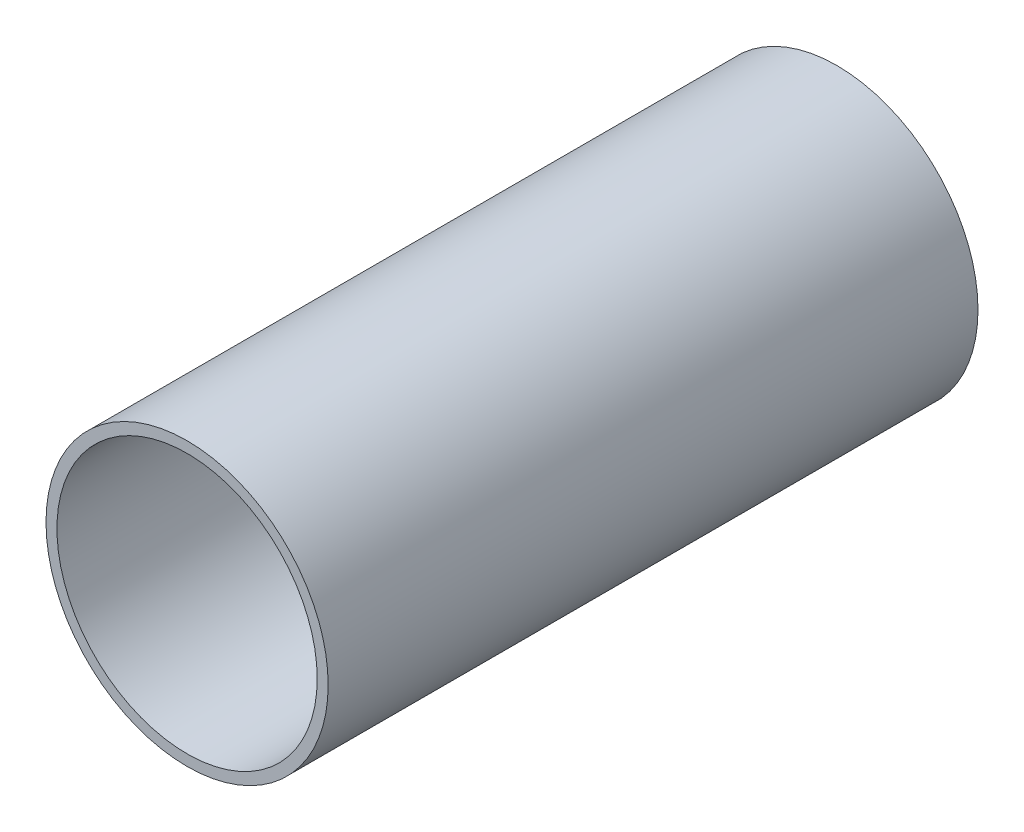
ISO-10303-21;
HEADER;
FILE_DESCRIPTION(('STEP AP214'),'2;1');
FILE_NAME('part.step','',(''),(''),'','','');
FILE_SCHEMA(('AUTOMOTIVE_DESIGN { 1 0 10303 214 1 1 1 1 }'));
ENDSEC;
DATA;
#1=APPLICATION_CONTEXT('core data for automotive mechanical design processes');
#2=APPLICATION_PROTOCOL_DEFINITION('international standard','automotive_design',2000,#1);
#3=PRODUCT_CONTEXT('',#1,'mechanical');
#4=PRODUCT('Part','Part','',(#3));
#5=PRODUCT_RELATED_PRODUCT_CATEGORY('part','',(#4));
#6=PRODUCT_DEFINITION_FORMATION('','',#4);
#7=PRODUCT_DEFINITION_CONTEXT('part definition',#1,'design');
#8=PRODUCT_DEFINITION('design','',#6,#7);
#9=PRODUCT_DEFINITION_SHAPE('','',#8);
#10=(LENGTH_UNIT() NAMED_UNIT(*) SI_UNIT(.MILLI.,.METRE.));
#11=(NAMED_UNIT(*) PLANE_ANGLE_UNIT() SI_UNIT($,.RADIAN.));
#12=(NAMED_UNIT(*) SI_UNIT($,.STERADIAN.) SOLID_ANGLE_UNIT());
#13=UNCERTAINTY_MEASURE_WITH_UNIT(LENGTH_MEASURE(1.E-05),#10,'distance_accuracy_value','');
#14=(GEOMETRIC_REPRESENTATION_CONTEXT(3) GLOBAL_UNCERTAINTY_ASSIGNED_CONTEXT((#13)) GLOBAL_UNIT_ASSIGNED_CONTEXT((#10,
#11,#12)) REPRESENTATION_CONTEXT('',''));
#15=CARTESIAN_POINT('',(0.,0.,0.));
#16=DIRECTION('',(0.,0.,1.));
#17=DIRECTION('',(1.,0.,0.));
#18=AXIS2_PLACEMENT_3D('',#15,#16,#17);
#19=CARTESIAN_POINT('',(240.,0.,308.5));
#20=DIRECTION('',(0.,0.,1.));
#21=DIRECTION('',(1.,0.,0.));
#22=AXIS2_PLACEMENT_3D('',#19,#20,#21);
#23=PLANE('',#22);
#24=CARTESIAN_POINT('',(240.,0.,308.5));
#25=DIRECTION('',(0.,0.,1.));
#26=DIRECTION('',(1.,0.,0.));
#27=AXIS2_PLACEMENT_3D('',#24,#25,#26);
#28=CIRCLE('',#27,80.);
#29=CARTESIAN_POINT('',(320.,0.,308.5));
#30=VERTEX_POINT('',#29);
#31=EDGE_CURVE('E10',#30,#30,#28,.T.);
#32=ORIENTED_EDGE('',*,*,#31,.T.);
#33=EDGE_LOOP('',(#32));
#34=FACE_BOUND('',#33,.T.);
#35=CARTESIAN_POINT('',(240.,0.,308.5));
#36=DIRECTION('',(0.,0.,1.));
#37=DIRECTION('',(1.,0.,0.));
#38=AXIS2_PLACEMENT_3D('',#35,#36,#37);
#39=CIRCLE('',#38,73.8);
#40=CARTESIAN_POINT('',(313.8,0.,308.5));
#41=VERTEX_POINT('',#40);
#42=EDGE_CURVE('E48',#41,#41,#39,.T.);
#43=ORIENTED_EDGE('',*,*,#42,.F.);
#44=EDGE_LOOP('',(#43));
#45=FACE_BOUND('',#44,.T.);
#46=ADVANCED_FACE('F40',(#34,#45),#23,.T.);
#47=CARTESIAN_POINT('',(240.,0.,-60.));
#48=DIRECTION('',(0.,0.,1.));
#49=DIRECTION('',(1.,0.,0.));
#50=AXIS2_PLACEMENT_3D('',#47,#48,#49);
#51=PLANE('',#50);
#52=CARTESIAN_POINT('',(240.,0.,-60.));
#53=DIRECTION('',(0.,0.,1.));
#54=DIRECTION('',(1.,0.,0.));
#55=AXIS2_PLACEMENT_3D('',#52,#53,#54);
#56=CIRCLE('',#55,80.);
#57=CARTESIAN_POINT('',(320.,0.,-60.));
#58=VERTEX_POINT('',#57);
#59=EDGE_CURVE('E41',#58,#58,#56,.T.);
#60=ORIENTED_EDGE('',*,*,#59,.F.);
#61=EDGE_LOOP('',(#60));
#62=FACE_BOUND('',#61,.T.);
#63=CARTESIAN_POINT('',(240.,0.,-60.));
#64=DIRECTION('',(0.,0.,1.));
#65=DIRECTION('',(1.,0.,0.));
#66=AXIS2_PLACEMENT_3D('',#63,#64,#65);
#67=CIRCLE('',#66,73.8);
#68=CARTESIAN_POINT('',(313.8,0.,-60.));
#69=VERTEX_POINT('',#68);
#70=EDGE_CURVE('E49',#69,#69,#67,.T.);
#71=ORIENTED_EDGE('',*,*,#70,.T.);
#72=EDGE_LOOP('',(#71));
#73=FACE_BOUND('',#72,.T.);
#74=ADVANCED_FACE('F58',(#62,#73),#51,.F.);
#75=CARTESIAN_POINT('',(240.,0.,308.5));
#76=DIRECTION('',(0.,0.,-1.));
#77=DIRECTION('',(-1.,0.,0.));
#78=AXIS2_PLACEMENT_3D('',#75,#76,#77);
#79=CYLINDRICAL_SURFACE('',#78,80.);
#80=ORIENTED_EDGE('',*,*,#31,.F.);
#81=EDGE_LOOP('',(#80));
#82=FACE_BOUND('',#81,.T.);
#83=ORIENTED_EDGE('',*,*,#59,.T.);
#84=EDGE_LOOP('',(#83));
#85=FACE_BOUND('',#84,.T.);
#86=ADVANCED_FACE('F39',(#82,#85),#79,.T.);
#87=CARTESIAN_POINT('',(240.,0.,308.5));
#88=DIRECTION('',(0.,0.,-1.));
#89=DIRECTION('',(-1.,0.,0.));
#90=AXIS2_PLACEMENT_3D('',#87,#88,#89);
#91=CYLINDRICAL_SURFACE('',#90,73.8);
#92=ORIENTED_EDGE('',*,*,#42,.T.);
#93=EDGE_LOOP('',(#92));
#94=FACE_BOUND('',#93,.T.);
#95=ORIENTED_EDGE('',*,*,#70,.F.);
#96=EDGE_LOOP('',(#95));
#97=FACE_BOUND('',#96,.T.);
#98=ADVANCED_FACE('F57',(#94,#97),#91,.F.);
#99=CLOSED_SHELL('',(#46,#74,#86,#98));
#100=MANIFOLD_SOLID_BREP('B2',#99);
#101=ADVANCED_BREP_SHAPE_REPRESENTATION('',(#18,#100),#14);
#102=SHAPE_DEFINITION_REPRESENTATION(#9,#101);
ENDSEC;
END-ISO-10303-21;
